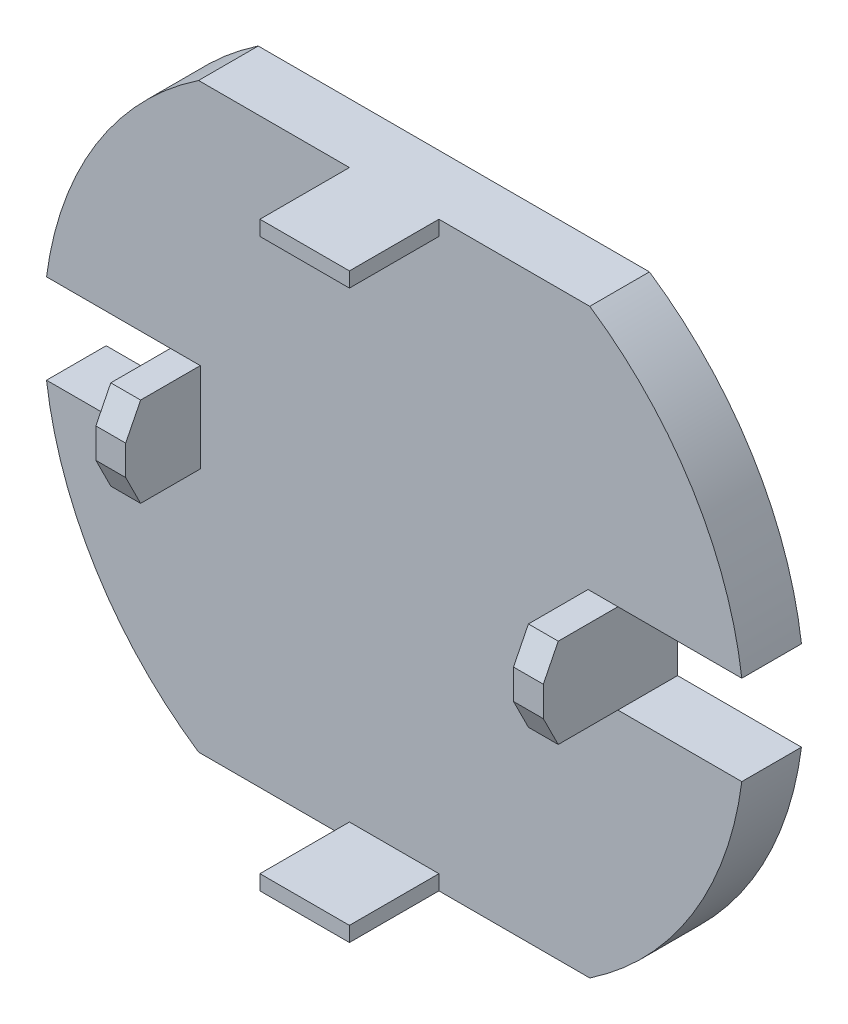
ISO-10303-21;
HEADER;
FILE_DESCRIPTION(('STEP AP214'),'2;1');
FILE_NAME('part.step','',(''),(''),'','','');
FILE_SCHEMA(('AUTOMOTIVE_DESIGN { 1 0 10303 214 1 1 1 1 }'));
ENDSEC;
DATA;
#1=APPLICATION_CONTEXT('core data for automotive mechanical design processes');
#2=APPLICATION_PROTOCOL_DEFINITION('international standard','automotive_design',2000,#1);
#3=PRODUCT_CONTEXT('',#1,'mechanical');
#4=PRODUCT('Part','Part','',(#3));
#5=PRODUCT_RELATED_PRODUCT_CATEGORY('part','',(#4));
#6=PRODUCT_DEFINITION_FORMATION('','',#4);
#7=PRODUCT_DEFINITION_CONTEXT('part definition',#1,'design');
#8=PRODUCT_DEFINITION('design','',#6,#7);
#9=PRODUCT_DEFINITION_SHAPE('','',#8);
#10=(LENGTH_UNIT() NAMED_UNIT(*) SI_UNIT(.MILLI.,.METRE.));
#11=(NAMED_UNIT(*) PLANE_ANGLE_UNIT() SI_UNIT($,.RADIAN.));
#12=(NAMED_UNIT(*) SI_UNIT($,.STERADIAN.) SOLID_ANGLE_UNIT());
#13=UNCERTAINTY_MEASURE_WITH_UNIT(LENGTH_MEASURE(1.E-05),#10,'distance_accuracy_value','');
#14=(GEOMETRIC_REPRESENTATION_CONTEXT(3) GLOBAL_UNCERTAINTY_ASSIGNED_CONTEXT((#13)) GLOBAL_UNIT_ASSIGNED_CONTEXT((#10,
#11,#12)) REPRESENTATION_CONTEXT('',''));
#15=CARTESIAN_POINT('',(0.,0.,0.));
#16=DIRECTION('',(0.,0.,1.));
#17=DIRECTION('',(1.,0.,0.));
#18=AXIS2_PLACEMENT_3D('',#15,#16,#17);
#19=CARTESIAN_POINT('',(0.,0.,0.));
#20=DIRECTION('',(0.,0.,-1.));
#21=DIRECTION('',(0.,-1.,0.));
#22=AXIS2_PLACEMENT_3D('',#19,#20,#21);
#23=PLANE('',#22);
#24=DIRECTION('',(1.,0.,0.));
#25=VECTOR('',#24,1.);
#26=CARTESIAN_POINT('',(-5.82693101040333,-0.75,0.));
#27=LINE('',#26,#25);
#28=CARTESIAN_POINT('',(-5.82693101040333,-0.75,0.));
#29=VERTEX_POINT('',#28);
#30=CARTESIAN_POINT('',(-3.75,-0.75,0.));
#31=VERTEX_POINT('',#30);
#32=EDGE_CURVE('E343',#29,#31,#27,.T.);
#33=ORIENTED_EDGE('',*,*,#32,.F.);
#34=CARTESIAN_POINT('',(0.,0.,0.));
#35=DIRECTION('',(0.,0.,-1.));
#36=DIRECTION('',(-0.558079874408681,-0.829787234042553,0.));
#37=AXIS2_PLACEMENT_3D('',#34,#35,#36);
#38=CIRCLE('',#37,5.875);
#39=CARTESIAN_POINT('',(-3.278719262151,-4.875,0.));
#40=VERTEX_POINT('',#39);
#41=EDGE_CURVE('E330',#40,#29,#38,.T.);
#42=ORIENTED_EDGE('',*,*,#41,.F.);
#43=DIRECTION('',(-1.,0.,0.));
#44=VECTOR('',#43,1.);
#45=CARTESIAN_POINT('',(-0.75,-4.875,0.));
#46=LINE('',#45,#44);
#47=CARTESIAN_POINT('',(-0.75,-4.875,0.));
#48=VERTEX_POINT('',#47);
#49=EDGE_CURVE('E417',#48,#40,#46,.T.);
#50=ORIENTED_EDGE('',*,*,#49,.F.);
#51=DIRECTION('',(0.,-1.,0.));
#52=VECTOR('',#51,1.);
#53=CARTESIAN_POINT('',(-0.75,-4.625,0.));
#54=LINE('',#53,#52);
#55=CARTESIAN_POINT('',(-0.75,-4.625,0.));
#56=VERTEX_POINT('',#55);
#57=EDGE_CURVE('E435',#56,#48,#54,.T.);
#58=ORIENTED_EDGE('',*,*,#57,.F.);
#59=DIRECTION('',(-1.,0.,0.));
#60=VECTOR('',#59,1.);
#61=CARTESIAN_POINT('',(0.75,-4.625,0.));
#62=LINE('',#61,#60);
#63=CARTESIAN_POINT('',(0.75,-4.625,0.));
#64=VERTEX_POINT('',#63);
#65=EDGE_CURVE('E369',#64,#56,#62,.T.);
#66=ORIENTED_EDGE('',*,*,#65,.F.);
#67=DIRECTION('',(0.,1.,0.));
#68=VECTOR('',#67,1.);
#69=CARTESIAN_POINT('',(0.75,-4.875,0.));
#70=LINE('',#69,#68);
#71=CARTESIAN_POINT('',(0.75,-4.875,0.));
#72=VERTEX_POINT('',#71);
#73=EDGE_CURVE('E386',#72,#64,#70,.T.);
#74=ORIENTED_EDGE('',*,*,#73,.F.);
#75=DIRECTION('',(-1.,0.,0.));
#76=VECTOR('',#75,1.);
#77=CARTESIAN_POINT('',(3.278719262151,-4.875,0.));
#78=LINE('',#77,#76);
#79=CARTESIAN_POINT('',(3.278719262151,-4.875,0.));
#80=VERTEX_POINT('',#79);
#81=EDGE_CURVE('E466',#80,#72,#78,.T.);
#82=ORIENTED_EDGE('',*,*,#81,.F.);
#83=CARTESIAN_POINT('',(0.,0.,0.));
#84=DIRECTION('',(0.,0.,-1.));
#85=DIRECTION('',(0.991818044323972,-0.127659574468085,0.));
#86=AXIS2_PLACEMENT_3D('',#83,#84,#85);
#87=CIRCLE('',#86,5.875);
#88=CARTESIAN_POINT('',(5.82693101040333,-0.75,0.));
#89=VERTEX_POINT('',#88);
#90=EDGE_CURVE('E363',#89,#80,#87,.T.);
#91=ORIENTED_EDGE('',*,*,#90,.F.);
#92=DIRECTION('',(1.,0.,0.));
#93=VECTOR('',#92,1.);
#94=CARTESIAN_POINT('',(3.25,-0.75,0.));
#95=LINE('',#94,#93);
#96=CARTESIAN_POINT('',(3.75,-0.75,0.));
#97=VERTEX_POINT('',#96);
#98=EDGE_CURVE('E111',#97,#89,#95,.T.);
#99=ORIENTED_EDGE('',*,*,#98,.F.);
#100=DIRECTION('',(1.,0.,0.));
#101=VECTOR('',#100,1.);
#102=CARTESIAN_POINT('',(3.25,-0.75,0.));
#103=LINE('',#102,#101);
#104=CARTESIAN_POINT('',(3.25,-0.75,0.));
#105=VERTEX_POINT('',#104);
#106=EDGE_CURVE('E405',#105,#97,#103,.T.);
#107=ORIENTED_EDGE('',*,*,#106,.F.);
#108=DIRECTION('',(0.,-1.,0.));
#109=VECTOR('',#108,1.);
#110=CARTESIAN_POINT('',(3.25,0.75,0.));
#111=LINE('',#110,#109);
#112=CARTESIAN_POINT('',(3.25,0.75,0.));
#113=VERTEX_POINT('',#112);
#114=EDGE_CURVE('E127',#113,#105,#111,.T.);
#115=ORIENTED_EDGE('',*,*,#114,.F.);
#116=DIRECTION('',(-1.,0.,0.));
#117=VECTOR('',#116,1.);
#118=CARTESIAN_POINT('',(5.82693101040333,0.75,0.));
#119=LINE('',#118,#117);
#120=CARTESIAN_POINT('',(3.75,0.75,0.));
#121=VERTEX_POINT('',#120);
#122=EDGE_CURVE('E350',#121,#113,#119,.T.);
#123=ORIENTED_EDGE('',*,*,#122,.F.);
#124=DIRECTION('',(-1.,0.,0.));
#125=VECTOR('',#124,1.);
#126=CARTESIAN_POINT('',(5.82693101040333,0.75,0.));
#127=LINE('',#126,#125);
#128=CARTESIAN_POINT('',(5.82693101040333,0.75,0.));
#129=VERTEX_POINT('',#128);
#130=EDGE_CURVE('E474',#129,#121,#127,.T.);
#131=ORIENTED_EDGE('',*,*,#130,.F.);
#132=CARTESIAN_POINT('',(0.,0.,0.));
#133=DIRECTION('',(0.,0.,-1.));
#134=DIRECTION('',(0.558079874408681,0.829787234042553,0.));
#135=AXIS2_PLACEMENT_3D('',#132,#133,#134);
#136=CIRCLE('',#135,5.875);
#137=CARTESIAN_POINT('',(3.278719262151,4.875,0.));
#138=VERTEX_POINT('',#137);
#139=EDGE_CURVE('E470',#138,#129,#136,.T.);
#140=ORIENTED_EDGE('',*,*,#139,.F.);
#141=DIRECTION('',(1.,0.,0.));
#142=VECTOR('',#141,1.);
#143=CARTESIAN_POINT('',(0.75,4.875,0.));
#144=LINE('',#143,#142);
#145=CARTESIAN_POINT('',(0.75,4.875,0.));
#146=VERTEX_POINT('',#145);
#147=EDGE_CURVE('E533',#146,#138,#144,.T.);
#148=ORIENTED_EDGE('',*,*,#147,.F.);
#149=DIRECTION('',(0.,1.,0.));
#150=VECTOR('',#149,1.);
#151=CARTESIAN_POINT('',(0.75,4.625,0.));
#152=LINE('',#151,#150);
#153=CARTESIAN_POINT('',(0.75,4.625,0.));
#154=VERTEX_POINT('',#153);
#155=EDGE_CURVE('E537',#154,#146,#152,.T.);
#156=ORIENTED_EDGE('',*,*,#155,.F.);
#157=DIRECTION('',(1.,0.,0.));
#158=VECTOR('',#157,1.);
#159=CARTESIAN_POINT('',(-0.75,4.625,0.));
#160=LINE('',#159,#158);
#161=CARTESIAN_POINT('',(-0.75,4.625,0.));
#162=VERTEX_POINT('',#161);
#163=EDGE_CURVE('E588',#162,#154,#160,.T.);
#164=ORIENTED_EDGE('',*,*,#163,.F.);
#165=DIRECTION('',(0.,-1.,0.));
#166=VECTOR('',#165,1.);
#167=CARTESIAN_POINT('',(-0.75,4.875,0.));
#168=LINE('',#167,#166);
#169=CARTESIAN_POINT('',(-0.75,4.875,0.));
#170=VERTEX_POINT('',#169);
#171=EDGE_CURVE('E423',#170,#162,#168,.T.);
#172=ORIENTED_EDGE('',*,*,#171,.F.);
#173=DIRECTION('',(1.,0.,0.));
#174=VECTOR('',#173,1.);
#175=CARTESIAN_POINT('',(-3.278719262151,4.875,0.));
#176=LINE('',#175,#174);
#177=CARTESIAN_POINT('',(-3.278719262151,4.875,0.));
#178=VERTEX_POINT('',#177);
#179=EDGE_CURVE('E20',#178,#170,#176,.T.);
#180=ORIENTED_EDGE('',*,*,#179,.F.);
#181=CARTESIAN_POINT('',(0.,0.,0.));
#182=DIRECTION('',(0.,0.,-1.));
#183=DIRECTION('',(-0.991818044323972,0.127659574468085,0.));
#184=AXIS2_PLACEMENT_3D('',#181,#182,#183);
#185=CIRCLE('',#184,5.875);
#186=CARTESIAN_POINT('',(-5.82693101040333,0.75,0.));
#187=VERTEX_POINT('',#186);
#188=EDGE_CURVE('E544',#187,#178,#185,.T.);
#189=ORIENTED_EDGE('',*,*,#188,.F.);
#190=DIRECTION('',(-1.,0.,0.));
#191=VECTOR('',#190,1.);
#192=CARTESIAN_POINT('',(-3.25,0.75,0.));
#193=LINE('',#192,#191);
#194=CARTESIAN_POINT('',(-3.75,0.75,0.));
#195=VERTEX_POINT('',#194);
#196=EDGE_CURVE('E27',#195,#187,#193,.T.);
#197=ORIENTED_EDGE('',*,*,#196,.F.);
#198=DIRECTION('',(-1.,0.,0.));
#199=VECTOR('',#198,1.);
#200=CARTESIAN_POINT('',(-3.25,0.75,0.));
#201=LINE('',#200,#199);
#202=CARTESIAN_POINT('',(-3.25,0.75,0.));
#203=VERTEX_POINT('',#202);
#204=EDGE_CURVE('E396',#203,#195,#201,.T.);
#205=ORIENTED_EDGE('',*,*,#204,.F.);
#206=DIRECTION('',(0.,1.,0.));
#207=VECTOR('',#206,1.);
#208=CARTESIAN_POINT('',(-3.25,-0.75,0.));
#209=LINE('',#208,#207);
#210=CARTESIAN_POINT('',(-3.25,-0.75,0.));
#211=VERTEX_POINT('',#210);
#212=EDGE_CURVE('E429',#211,#203,#209,.T.);
#213=ORIENTED_EDGE('',*,*,#212,.F.);
#214=DIRECTION('',(1.,0.,0.));
#215=VECTOR('',#214,1.);
#216=CARTESIAN_POINT('',(-5.82693101040333,-0.75,0.));
#217=LINE('',#216,#215);
#218=EDGE_CURVE('E345',#31,#211,#217,.T.);
#219=ORIENTED_EDGE('',*,*,#218,.F.);
#220=EDGE_LOOP('',(#33,#42,#50,#58,#66,#74,#82,#91,#99,#107,#115,#123,#131,#140,#148,#156,#164,
#172,#180,#189,#197,#205,#213,#219));
#221=FACE_BOUND('',#220,.T.);
#222=ADVANCED_FACE('F16',(#221),#23,.F.);
#223=CARTESIAN_POINT('',(0.,0.,-1.));
#224=DIRECTION('',(0.,0.,-1.));
#225=DIRECTION('',(0.,-1.,0.));
#226=AXIS2_PLACEMENT_3D('',#223,#224,#225);
#227=PLANE('',#226);
#228=CARTESIAN_POINT('',(0.,0.,-1.));
#229=DIRECTION('',(0.,0.,1.));
#230=DIRECTION('',(-1.,0.,0.));
#231=AXIS2_PLACEMENT_3D('',#228,#229,#230);
#232=CIRCLE('',#231,2.5);
#233=CARTESIAN_POINT('',(-2.5,0.,-1.));
#234=VERTEX_POINT('',#233);
#235=CARTESIAN_POINT('',(2.5,0.,-1.));
#236=VERTEX_POINT('',#235);
#237=EDGE_CURVE('E513',#234,#236,#232,.T.);
#238=ORIENTED_EDGE('',*,*,#237,.T.);
#239=CARTESIAN_POINT('',(0.,0.,-1.));
#240=DIRECTION('',(0.,0.,1.));
#241=DIRECTION('',(-1.,0.,0.));
#242=AXIS2_PLACEMENT_3D('',#239,#240,#241);
#243=CIRCLE('',#242,2.5);
#244=EDGE_CURVE('E509',#236,#234,#243,.T.);
#245=ORIENTED_EDGE('',*,*,#244,.T.);
#246=EDGE_LOOP('',(#238,#245));
#247=FACE_BOUND('',#246,.T.);
#248=DIRECTION('',(1.,0.,0.));
#249=VECTOR('',#248,1.);
#250=CARTESIAN_POINT('',(-5.82693101040333,-0.75,-1.));
#251=LINE('',#250,#249);
#252=CARTESIAN_POINT('',(-5.82693101040333,-0.75,-1.));
#253=VERTEX_POINT('',#252);
#254=CARTESIAN_POINT('',(-3.75,-0.75,-1.));
#255=VERTEX_POINT('',#254);
#256=EDGE_CURVE('E187',#253,#255,#251,.T.);
#257=ORIENTED_EDGE('',*,*,#256,.T.);
#258=DIRECTION('',(0.,-1.,0.));
#259=VECTOR('',#258,1.);
#260=CARTESIAN_POINT('',(-3.75,0.75,-1.));
#261=LINE('',#260,#259);
#262=CARTESIAN_POINT('',(-3.75,0.75,-1.));
#263=VERTEX_POINT('',#262);
#264=EDGE_CURVE('E359',#263,#255,#261,.T.);
#265=ORIENTED_EDGE('',*,*,#264,.F.);
#266=DIRECTION('',(-1.,0.,0.));
#267=VECTOR('',#266,1.);
#268=CARTESIAN_POINT('',(-3.25,0.75,-1.));
#269=LINE('',#268,#267);
#270=CARTESIAN_POINT('',(-5.82693101040333,0.75,-1.));
#271=VERTEX_POINT('',#270);
#272=EDGE_CURVE('E11',#263,#271,#269,.T.);
#273=ORIENTED_EDGE('',*,*,#272,.T.);
#274=CARTESIAN_POINT('',(0.,0.,-1.));
#275=DIRECTION('',(0.,0.,-1.));
#276=DIRECTION('',(-0.991818044323972,0.127659574468085,0.));
#277=AXIS2_PLACEMENT_3D('',#274,#275,#276);
#278=CIRCLE('',#277,5.875);
#279=CARTESIAN_POINT('',(-3.278719262151,4.875,-1.));
#280=VERTEX_POINT('',#279);
#281=EDGE_CURVE('E540',#271,#280,#278,.T.);
#282=ORIENTED_EDGE('',*,*,#281,.T.);
#283=DIRECTION('',(1.,0.,0.));
#284=VECTOR('',#283,1.);
#285=CARTESIAN_POINT('',(-3.278719262151,4.875,-1.));
#286=LINE('',#285,#284);
#287=CARTESIAN_POINT('',(3.278719262151,4.875,-1.));
#288=VERTEX_POINT('',#287);
#289=EDGE_CURVE('E529',#280,#288,#286,.T.);
#290=ORIENTED_EDGE('',*,*,#289,.T.);
#291=CARTESIAN_POINT('',(0.,0.,-1.));
#292=DIRECTION('',(0.,0.,-1.));
#293=DIRECTION('',(0.558079874408681,0.829787234042553,0.));
#294=AXIS2_PLACEMENT_3D('',#291,#292,#293);
#295=CIRCLE('',#294,5.875);
#296=CARTESIAN_POINT('',(5.82693101040333,0.75,-1.));
#297=VERTEX_POINT('',#296);
#298=EDGE_CURVE('E473',#288,#297,#295,.T.);
#299=ORIENTED_EDGE('',*,*,#298,.T.);
#300=DIRECTION('',(-1.,0.,0.));
#301=VECTOR('',#300,1.);
#302=CARTESIAN_POINT('',(5.82693101040333,0.75,-1.));
#303=LINE('',#302,#301);
#304=CARTESIAN_POINT('',(3.75,0.75,-1.));
#305=VERTEX_POINT('',#304);
#306=EDGE_CURVE('E591',#297,#305,#303,.T.);
#307=ORIENTED_EDGE('',*,*,#306,.T.);
#308=DIRECTION('',(0.,1.,0.));
#309=VECTOR('',#308,1.);
#310=CARTESIAN_POINT('',(3.75,-0.75,-1.));
#311=LINE('',#310,#309);
#312=CARTESIAN_POINT('',(3.75,-0.75,-1.));
#313=VERTEX_POINT('',#312);
#314=EDGE_CURVE('E456',#313,#305,#311,.T.);
#315=ORIENTED_EDGE('',*,*,#314,.F.);
#316=DIRECTION('',(1.,0.,0.));
#317=VECTOR('',#316,1.);
#318=CARTESIAN_POINT('',(3.25,-0.75,-1.));
#319=LINE('',#318,#317);
#320=CARTESIAN_POINT('',(5.82693101040333,-0.75,-1.));
#321=VERTEX_POINT('',#320);
#322=EDGE_CURVE('E583',#313,#321,#319,.T.);
#323=ORIENTED_EDGE('',*,*,#322,.T.);
#324=CARTESIAN_POINT('',(0.,0.,-1.));
#325=DIRECTION('',(0.,0.,-1.));
#326=DIRECTION('',(0.991818044323972,-0.127659574468085,0.));
#327=AXIS2_PLACEMENT_3D('',#324,#325,#326);
#328=CIRCLE('',#327,5.875);
#329=CARTESIAN_POINT('',(3.278719262151,-4.875,-1.));
#330=VERTEX_POINT('',#329);
#331=EDGE_CURVE('E487',#321,#330,#328,.T.);
#332=ORIENTED_EDGE('',*,*,#331,.T.);
#333=DIRECTION('',(-1.,0.,0.));
#334=VECTOR('',#333,1.);
#335=CARTESIAN_POINT('',(3.278719262151,-4.875,-1.));
#336=LINE('',#335,#334);
#337=CARTESIAN_POINT('',(-3.278719262151,-4.875,-1.));
#338=VERTEX_POINT('',#337);
#339=EDGE_CURVE('E413',#330,#338,#336,.T.);
#340=ORIENTED_EDGE('',*,*,#339,.T.);
#341=CARTESIAN_POINT('',(0.,0.,-1.));
#342=DIRECTION('',(0.,0.,-1.));
#343=DIRECTION('',(-0.558079874408681,-0.829787234042553,0.));
#344=AXIS2_PLACEMENT_3D('',#341,#342,#343);
#345=CIRCLE('',#344,5.875);
#346=EDGE_CURVE('E339',#338,#253,#345,.T.);
#347=ORIENTED_EDGE('',*,*,#346,.T.);
#348=EDGE_LOOP('',(#257,#265,#273,#282,#290,#299,#307,#315,#323,#332,#340,#347));
#349=FACE_BOUND('',#348,.T.);
#350=ADVANCED_FACE('F805',(#247,#349),#227,.T.);
#351=CARTESIAN_POINT('',(-3.25,0.75,0.));
#352=DIRECTION('',(0.,-1.,0.));
#353=DIRECTION('',(0.,0.,-1.));
#354=AXIS2_PLACEMENT_3D('',#351,#352,#353);
#355=PLANE('',#354);
#356=DIRECTION('',(0.,0.,1.));
#357=VECTOR('',#356,1.);
#358=CARTESIAN_POINT('',(-3.75,0.75,0.0625));
#359=LINE('',#358,#357);
#360=EDGE_CURVE('E457',#263,#195,#359,.T.);
#361=ORIENTED_EDGE('',*,*,#360,.T.);
#362=ORIENTED_EDGE('',*,*,#196,.T.);
#363=DIRECTION('',(0.,0.,-1.));
#364=VECTOR('',#363,1.);
#365=CARTESIAN_POINT('',(-5.82693101040333,0.75,0.));
#366=LINE('',#365,#364);
#367=EDGE_CURVE('E543',#187,#271,#366,.T.);
#368=ORIENTED_EDGE('',*,*,#367,.T.);
#369=ORIENTED_EDGE('',*,*,#272,.F.);
#370=EDGE_LOOP('',(#361,#362,#368,#369));
#371=FACE_BOUND('',#370,.T.);
#372=ADVANCED_FACE('F801',(#371),#355,.T.);
#373=CARTESIAN_POINT('',(0.,0.,0.));
#374=DIRECTION('',(0.,0.,-1.));
#375=DIRECTION('',(-0.991818044323972,0.127659574468085,0.));
#376=AXIS2_PLACEMENT_3D('',#373,#374,#375);
#377=CYLINDRICAL_SURFACE('',#376,5.875);
#378=ORIENTED_EDGE('',*,*,#188,.T.);
#379=DIRECTION('',(0.,0.,-1.));
#380=VECTOR('',#379,1.);
#381=CARTESIAN_POINT('',(-3.278719262151,4.875,0.));
#382=LINE('',#381,#380);
#383=EDGE_CURVE('E532',#178,#280,#382,.T.);
#384=ORIENTED_EDGE('',*,*,#383,.T.);
#385=ORIENTED_EDGE('',*,*,#281,.F.);
#386=ORIENTED_EDGE('',*,*,#367,.F.);
#387=EDGE_LOOP('',(#378,#384,#385,#386));
#388=FACE_BOUND('',#387,.T.);
#389=ADVANCED_FACE('F682',(#388),#377,.T.);
#390=CARTESIAN_POINT('',(-3.278719262151,4.875,0.));
#391=DIRECTION('',(0.,1.,0.));
#392=DIRECTION('',(1.,0.,0.));
#393=AXIS2_PLACEMENT_3D('',#390,#391,#392);
#394=PLANE('',#393);
#395=ORIENTED_EDGE('',*,*,#179,.T.);
#396=DIRECTION('',(0.,0.,1.));
#397=VECTOR('',#396,1.);
#398=CARTESIAN_POINT('',(-0.75,4.875,-1.));
#399=LINE('',#398,#397);
#400=CARTESIAN_POINT('',(-0.75,4.875,1.5));
#401=VERTEX_POINT('',#400);
#402=EDGE_CURVE('E554',#170,#401,#399,.T.);
#403=ORIENTED_EDGE('',*,*,#402,.T.);
#404=DIRECTION('',(1.,0.,0.));
#405=VECTOR('',#404,1.);
#406=CARTESIAN_POINT('',(0.375,4.875,1.5));
#407=LINE('',#406,#405);
#408=CARTESIAN_POINT('',(0.75,4.875,1.5));
#409=VERTEX_POINT('',#408);
#410=EDGE_CURVE('E219',#401,#409,#407,.T.);
#411=ORIENTED_EDGE('',*,*,#410,.T.);
#412=DIRECTION('',(0.,0.,1.));
#413=VECTOR('',#412,1.);
#414=CARTESIAN_POINT('',(0.75,4.875,-1.));
#415=LINE('',#414,#413);
#416=EDGE_CURVE('E520',#146,#409,#415,.T.);
#417=ORIENTED_EDGE('',*,*,#416,.F.);
#418=ORIENTED_EDGE('',*,*,#147,.T.);
#419=DIRECTION('',(0.,0.,-1.));
#420=VECTOR('',#419,1.);
#421=CARTESIAN_POINT('',(3.278719262151,4.875,0.));
#422=LINE('',#421,#420);
#423=EDGE_CURVE('E653',#138,#288,#422,.T.);
#424=ORIENTED_EDGE('',*,*,#423,.T.);
#425=ORIENTED_EDGE('',*,*,#289,.F.);
#426=ORIENTED_EDGE('',*,*,#383,.F.);
#427=EDGE_LOOP('',(#395,#403,#411,#417,#418,#424,#425,#426));
#428=FACE_BOUND('',#427,.T.);
#429=ADVANCED_FACE('F689',(#428),#394,.T.);
#430=CARTESIAN_POINT('',(0.,0.,0.));
#431=DIRECTION('',(0.,0.,-1.));
#432=DIRECTION('',(0.558079874408681,0.829787234042553,0.));
#433=AXIS2_PLACEMENT_3D('',#430,#431,#432);
#434=CYLINDRICAL_SURFACE('',#433,5.875);
#435=ORIENTED_EDGE('',*,*,#139,.T.);
#436=DIRECTION('',(0.,0.,-1.));
#437=VECTOR('',#436,1.);
#438=CARTESIAN_POINT('',(5.82693101040333,0.75,0.));
#439=LINE('',#438,#437);
#440=EDGE_CURVE('E645',#129,#297,#439,.T.);
#441=ORIENTED_EDGE('',*,*,#440,.T.);
#442=ORIENTED_EDGE('',*,*,#298,.F.);
#443=ORIENTED_EDGE('',*,*,#423,.F.);
#444=EDGE_LOOP('',(#435,#441,#442,#443));
#445=FACE_BOUND('',#444,.T.);
#446=ADVANCED_FACE('F745',(#445),#434,.T.);
#447=CARTESIAN_POINT('',(5.82693101040333,0.75,0.));
#448=DIRECTION('',(0.,-1.,0.));
#449=DIRECTION('',(0.,0.,-1.));
#450=AXIS2_PLACEMENT_3D('',#447,#448,#449);
#451=PLANE('',#450);
#452=DIRECTION('',(0.,0.,-1.));
#453=VECTOR('',#452,1.);
#454=CARTESIAN_POINT('',(3.75,0.75,0.0625));
#455=LINE('',#454,#453);
#456=EDGE_CURVE('E452',#121,#305,#455,.T.);
#457=ORIENTED_EDGE('',*,*,#456,.T.);
#458=ORIENTED_EDGE('',*,*,#306,.F.);
#459=ORIENTED_EDGE('',*,*,#440,.F.);
#460=ORIENTED_EDGE('',*,*,#130,.T.);
#461=EDGE_LOOP('',(#457,#458,#459,#460));
#462=FACE_BOUND('',#461,.T.);
#463=ADVANCED_FACE('F725',(#462),#451,.T.);
#464=CARTESIAN_POINT('',(3.25,-0.75,0.));
#465=DIRECTION('',(0.,1.,0.));
#466=DIRECTION('',(1.,0.,0.));
#467=AXIS2_PLACEMENT_3D('',#464,#465,#466);
#468=PLANE('',#467);
#469=DIRECTION('',(0.,0.,1.));
#470=VECTOR('',#469,1.);
#471=CARTESIAN_POINT('',(3.75,-0.75,0.0625));
#472=LINE('',#471,#470);
#473=EDGE_CURVE('E391',#313,#97,#472,.T.);
#474=ORIENTED_EDGE('',*,*,#473,.T.);
#475=ORIENTED_EDGE('',*,*,#98,.T.);
#476=DIRECTION('',(0.,0.,-1.));
#477=VECTOR('',#476,1.);
#478=CARTESIAN_POINT('',(5.82693101040333,-0.75,0.));
#479=LINE('',#478,#477);
#480=EDGE_CURVE('E483',#89,#321,#479,.T.);
#481=ORIENTED_EDGE('',*,*,#480,.T.);
#482=ORIENTED_EDGE('',*,*,#322,.F.);
#483=EDGE_LOOP('',(#474,#475,#481,#482));
#484=FACE_BOUND('',#483,.T.);
#485=ADVANCED_FACE('F720',(#484),#468,.T.);
#486=CARTESIAN_POINT('',(0.,0.,0.));
#487=DIRECTION('',(0.,0.,-1.));
#488=DIRECTION('',(0.991818044323972,-0.127659574468085,0.));
#489=AXIS2_PLACEMENT_3D('',#486,#487,#488);
#490=CYLINDRICAL_SURFACE('',#489,5.875);
#491=ORIENTED_EDGE('',*,*,#90,.T.);
#492=DIRECTION('',(0.,0.,-1.));
#493=VECTOR('',#492,1.);
#494=CARTESIAN_POINT('',(3.278719262151,-4.875,0.));
#495=LINE('',#494,#493);
#496=EDGE_CURVE('E416',#80,#330,#495,.T.);
#497=ORIENTED_EDGE('',*,*,#496,.T.);
#498=ORIENTED_EDGE('',*,*,#331,.F.);
#499=ORIENTED_EDGE('',*,*,#480,.F.);
#500=EDGE_LOOP('',(#491,#497,#498,#499));
#501=FACE_BOUND('',#500,.T.);
#502=ADVANCED_FACE('F724',(#501),#490,.T.);
#503=CARTESIAN_POINT('',(3.278719262151,-4.875,0.));
#504=DIRECTION('',(0.,-1.,0.));
#505=DIRECTION('',(0.,0.,-1.));
#506=AXIS2_PLACEMENT_3D('',#503,#504,#505);
#507=PLANE('',#506);
#508=ORIENTED_EDGE('',*,*,#81,.T.);
#509=DIRECTION('',(0.,0.,1.));
#510=VECTOR('',#509,1.);
#511=CARTESIAN_POINT('',(0.75,-4.875,-1.));
#512=LINE('',#511,#510);
#513=CARTESIAN_POINT('',(0.75,-4.875,1.5));
#514=VERTEX_POINT('',#513);
#515=EDGE_CURVE('E374',#72,#514,#512,.T.);
#516=ORIENTED_EDGE('',*,*,#515,.T.);
#517=DIRECTION('',(-1.,0.,0.));
#518=VECTOR('',#517,1.);
#519=CARTESIAN_POINT('',(-0.375,-4.875,1.5));
#520=LINE('',#519,#518);
#521=CARTESIAN_POINT('',(-0.75,-4.875,1.5));
#522=VERTEX_POINT('',#521);
#523=EDGE_CURVE('E340',#514,#522,#520,.T.);
#524=ORIENTED_EDGE('',*,*,#523,.T.);
#525=DIRECTION('',(0.,0.,1.));
#526=VECTOR('',#525,1.);
#527=CARTESIAN_POINT('',(-0.75,-4.875,-1.));
#528=LINE('',#527,#526);
#529=EDGE_CURVE('E439',#48,#522,#528,.T.);
#530=ORIENTED_EDGE('',*,*,#529,.F.);
#531=ORIENTED_EDGE('',*,*,#49,.T.);
#532=DIRECTION('',(0.,0.,-1.));
#533=VECTOR('',#532,1.);
#534=CARTESIAN_POINT('',(-3.278719262151,-4.875,0.));
#535=LINE('',#534,#533);
#536=EDGE_CURVE('E337',#40,#338,#535,.T.);
#537=ORIENTED_EDGE('',*,*,#536,.T.);
#538=ORIENTED_EDGE('',*,*,#339,.F.);
#539=ORIENTED_EDGE('',*,*,#496,.F.);
#540=EDGE_LOOP('',(#508,#516,#524,#530,#531,#537,#538,#539));
#541=FACE_BOUND('',#540,.T.);
#542=ADVANCED_FACE('F607',(#541),#507,.T.);
#543=CARTESIAN_POINT('',(0.,0.,0.));
#544=DIRECTION('',(0.,0.,-1.));
#545=DIRECTION('',(-0.558079874408681,-0.829787234042553,0.));
#546=AXIS2_PLACEMENT_3D('',#543,#544,#545);
#547=CYLINDRICAL_SURFACE('',#546,5.875);
#548=ORIENTED_EDGE('',*,*,#41,.T.);
#549=DIRECTION('',(0.,0.,-1.));
#550=VECTOR('',#549,1.);
#551=CARTESIAN_POINT('',(-5.82693101040333,-0.75,0.));
#552=LINE('',#551,#550);
#553=EDGE_CURVE('E335',#29,#253,#552,.T.);
#554=ORIENTED_EDGE('',*,*,#553,.T.);
#555=ORIENTED_EDGE('',*,*,#346,.F.);
#556=ORIENTED_EDGE('',*,*,#536,.F.);
#557=EDGE_LOOP('',(#548,#554,#555,#556));
#558=FACE_BOUND('',#557,.T.);
#559=ADVANCED_FACE('F332',(#558),#547,.T.);
#560=CARTESIAN_POINT('',(0.,0.,1.5));
#561=DIRECTION('',(0.,0.,1.));
#562=DIRECTION('',(1.,0.,0.));
#563=AXIS2_PLACEMENT_3D('',#560,#561,#562);
#564=PLANE('',#563);
#565=ORIENTED_EDGE('',*,*,#523,.F.);
#566=DIRECTION('',(0.,-1.,0.));
#567=VECTOR('',#566,1.);
#568=CARTESIAN_POINT('',(0.75,-2.4375,1.5));
#569=LINE('',#568,#567);
#570=CARTESIAN_POINT('',(0.75,-4.625,1.5));
#571=VERTEX_POINT('',#570);
#572=EDGE_CURVE('E523',#571,#514,#569,.T.);
#573=ORIENTED_EDGE('',*,*,#572,.F.);
#574=DIRECTION('',(1.,0.,0.));
#575=VECTOR('',#574,1.);
#576=CARTESIAN_POINT('',(0.375,-4.625,1.5));
#577=LINE('',#576,#575);
#578=CARTESIAN_POINT('',(-0.75,-4.625,1.5));
#579=VERTEX_POINT('',#578);
#580=EDGE_CURVE('E440',#579,#571,#577,.T.);
#581=ORIENTED_EDGE('',*,*,#580,.F.);
#582=DIRECTION('',(0.,1.,0.));
#583=VECTOR('',#582,1.);
#584=CARTESIAN_POINT('',(-0.75,-2.3125,1.5));
#585=LINE('',#584,#583);
#586=EDGE_CURVE('E465',#522,#579,#585,.T.);
#587=ORIENTED_EDGE('',*,*,#586,.F.);
#588=EDGE_LOOP('',(#565,#573,#581,#587));
#589=FACE_BOUND('',#588,.T.);
#590=ADVANCED_FACE('F619',(#589),#564,.T.);
#591=CARTESIAN_POINT('',(-0.75,-4.625,-1.));
#592=DIRECTION('',(-1.,0.,0.));
#593=DIRECTION('',(0.,0.,1.));
#594=AXIS2_PLACEMENT_3D('',#591,#592,#593);
#595=PLANE('',#594);
#596=ORIENTED_EDGE('',*,*,#57,.T.);
#597=ORIENTED_EDGE('',*,*,#529,.T.);
#598=ORIENTED_EDGE('',*,*,#586,.T.);
#599=DIRECTION('',(0.,0.,1.));
#600=VECTOR('',#599,1.);
#601=CARTESIAN_POINT('',(-0.75,-4.625,-1.));
#602=LINE('',#601,#600);
#603=EDGE_CURVE('E373',#56,#579,#602,.T.);
#604=ORIENTED_EDGE('',*,*,#603,.F.);
#605=EDGE_LOOP('',(#596,#597,#598,#604));
#606=FACE_BOUND('',#605,.T.);
#607=ADVANCED_FACE('F859',(#606),#595,.T.);
#608=CARTESIAN_POINT('',(0.75,-4.625,-1.));
#609=DIRECTION('',(0.,1.,0.));
#610=DIRECTION('',(1.,0.,0.));
#611=AXIS2_PLACEMENT_3D('',#608,#609,#610);
#612=PLANE('',#611);
#613=ORIENTED_EDGE('',*,*,#65,.T.);
#614=ORIENTED_EDGE('',*,*,#603,.T.);
#615=ORIENTED_EDGE('',*,*,#580,.T.);
#616=DIRECTION('',(0.,0.,1.));
#617=VECTOR('',#616,1.);
#618=CARTESIAN_POINT('',(0.75,-4.625,-1.));
#619=LINE('',#618,#617);
#620=EDGE_CURVE('E395',#64,#571,#619,.T.);
#621=ORIENTED_EDGE('',*,*,#620,.F.);
#622=EDGE_LOOP('',(#613,#614,#615,#621));
#623=FACE_BOUND('',#622,.T.);
#624=ADVANCED_FACE('F891',(#623),#612,.T.);
#625=CARTESIAN_POINT('',(0.75,-4.875,-1.));
#626=DIRECTION('',(1.,0.,0.));
#627=DIRECTION('',(0.,1.,0.));
#628=AXIS2_PLACEMENT_3D('',#625,#626,#627);
#629=PLANE('',#628);
#630=ORIENTED_EDGE('',*,*,#73,.T.);
#631=ORIENTED_EDGE('',*,*,#620,.T.);
#632=ORIENTED_EDGE('',*,*,#572,.T.);
#633=ORIENTED_EDGE('',*,*,#515,.F.);
#634=EDGE_LOOP('',(#630,#631,#632,#633));
#635=FACE_BOUND('',#634,.T.);
#636=ADVANCED_FACE('F615',(#635),#629,.T.);
#637=CARTESIAN_POINT('',(0.,0.,1.5));
#638=DIRECTION('',(0.,0.,1.));
#639=DIRECTION('',(1.,0.,0.));
#640=AXIS2_PLACEMENT_3D('',#637,#638,#639);
#641=PLANE('',#640);
#642=ORIENTED_EDGE('',*,*,#410,.F.);
#643=DIRECTION('',(0.,1.,0.));
#644=VECTOR('',#643,1.);
#645=CARTESIAN_POINT('',(-0.75,2.4375,1.5));
#646=LINE('',#645,#644);
#647=CARTESIAN_POINT('',(-0.75,4.625,1.5));
#648=VERTEX_POINT('',#647);
#649=EDGE_CURVE('E422',#648,#401,#646,.T.);
#650=ORIENTED_EDGE('',*,*,#649,.F.);
#651=DIRECTION('',(-1.,0.,0.));
#652=VECTOR('',#651,1.);
#653=CARTESIAN_POINT('',(-0.375,4.625,1.5));
#654=LINE('',#653,#652);
#655=CARTESIAN_POINT('',(0.75,4.625,1.5));
#656=VERTEX_POINT('',#655);
#657=EDGE_CURVE('E207',#656,#648,#654,.T.);
#658=ORIENTED_EDGE('',*,*,#657,.F.);
#659=DIRECTION('',(0.,-1.,0.));
#660=VECTOR('',#659,1.);
#661=CARTESIAN_POINT('',(0.75,2.3125,1.5));
#662=LINE('',#661,#660);
#663=EDGE_CURVE('E387',#409,#656,#662,.T.);
#664=ORIENTED_EDGE('',*,*,#663,.F.);
#665=EDGE_LOOP('',(#642,#650,#658,#664));
#666=FACE_BOUND('',#665,.T.);
#667=ADVANCED_FACE('F759',(#666),#641,.T.);
#668=CARTESIAN_POINT('',(0.75,4.625,-1.));
#669=DIRECTION('',(1.,0.,0.));
#670=DIRECTION('',(0.,1.,0.));
#671=AXIS2_PLACEMENT_3D('',#668,#669,#670);
#672=PLANE('',#671);
#673=ORIENTED_EDGE('',*,*,#155,.T.);
#674=ORIENTED_EDGE('',*,*,#416,.T.);
#675=ORIENTED_EDGE('',*,*,#663,.T.);
#676=DIRECTION('',(0.,0.,1.));
#677=VECTOR('',#676,1.);
#678=CARTESIAN_POINT('',(0.75,4.625,-1.));
#679=LINE('',#678,#677);
#680=EDGE_CURVE('E574',#154,#656,#679,.T.);
#681=ORIENTED_EDGE('',*,*,#680,.F.);
#682=EDGE_LOOP('',(#673,#674,#675,#681));
#683=FACE_BOUND('',#682,.T.);
#684=ADVANCED_FACE('F763',(#683),#672,.T.);
#685=CARTESIAN_POINT('',(-0.75,4.625,-1.));
#686=DIRECTION('',(0.,-1.,0.));
#687=DIRECTION('',(0.,0.,-1.));
#688=AXIS2_PLACEMENT_3D('',#685,#686,#687);
#689=PLANE('',#688);
#690=ORIENTED_EDGE('',*,*,#163,.T.);
#691=ORIENTED_EDGE('',*,*,#680,.T.);
#692=ORIENTED_EDGE('',*,*,#657,.T.);
#693=DIRECTION('',(0.,0.,1.));
#694=VECTOR('',#693,1.);
#695=CARTESIAN_POINT('',(-0.75,4.625,-1.));
#696=LINE('',#695,#694);
#697=EDGE_CURVE('E418',#162,#648,#696,.T.);
#698=ORIENTED_EDGE('',*,*,#697,.F.);
#699=EDGE_LOOP('',(#690,#691,#692,#698));
#700=FACE_BOUND('',#699,.T.);
#701=ADVANCED_FACE('F841',(#700),#689,.T.);
#702=CARTESIAN_POINT('',(-0.75,4.875,-1.));
#703=DIRECTION('',(-1.,0.,0.));
#704=DIRECTION('',(0.,0.,1.));
#705=AXIS2_PLACEMENT_3D('',#702,#703,#704);
#706=PLANE('',#705);
#707=ORIENTED_EDGE('',*,*,#171,.T.);
#708=ORIENTED_EDGE('',*,*,#697,.T.);
#709=ORIENTED_EDGE('',*,*,#649,.T.);
#710=ORIENTED_EDGE('',*,*,#402,.F.);
#711=EDGE_LOOP('',(#707,#708,#709,#710));
#712=FACE_BOUND('',#711,.T.);
#713=ADVANCED_FACE('F871',(#712),#706,.T.);
#714=CARTESIAN_POINT('',(0.,0.,-2.));
#715=DIRECTION('',(0.,0.,-1.));
#716=DIRECTION('',(0.,-1.,0.));
#717=AXIS2_PLACEMENT_3D('',#714,#715,#716);
#718=PLANE('',#717);
#719=CARTESIAN_POINT('',(0.,0.,-2.));
#720=DIRECTION('',(0.,0.,-1.));
#721=DIRECTION('',(-1.,0.,0.));
#722=AXIS2_PLACEMENT_3D('',#719,#720,#721);
#723=CIRCLE('',#722,2.5);
#724=CARTESIAN_POINT('',(-2.5,0.,-2.));
#725=VERTEX_POINT('',#724);
#726=CARTESIAN_POINT('',(2.5,0.,-2.));
#727=VERTEX_POINT('',#726);
#728=EDGE_CURVE('E390',#725,#727,#723,.T.);
#729=ORIENTED_EDGE('',*,*,#728,.T.);
#730=CARTESIAN_POINT('',(0.,0.,-2.));
#731=DIRECTION('',(0.,0.,-1.));
#732=DIRECTION('',(-1.,0.,0.));
#733=AXIS2_PLACEMENT_3D('',#730,#731,#732);
#734=CIRCLE('',#733,2.5);
#735=EDGE_CURVE('E478',#727,#725,#734,.T.);
#736=ORIENTED_EDGE('',*,*,#735,.T.);
#737=EDGE_LOOP('',(#729,#736));
#738=FACE_BOUND('',#737,.T.);
#739=ADVANCED_FACE('F875',(#738),#718,.T.);
#740=CARTESIAN_POINT('',(0.,0.,-1.));
#741=DIRECTION('',(0.,0.,-1.));
#742=DIRECTION('',(-1.,0.,0.));
#743=AXIS2_PLACEMENT_3D('',#740,#741,#742);
#744=CYLINDRICAL_SURFACE('',#743,2.5);
#745=ORIENTED_EDGE('',*,*,#728,.F.);
#746=ORIENTED_EDGE('',*,*,#735,.F.);
#747=DIRECTION('',(0.,0.,1.));
#748=VECTOR('',#747,1.);
#749=CARTESIAN_POINT('',(2.5,0.,-1.));
#750=LINE('',#749,#748);
#751=EDGE_CURVE('E598',#727,#236,#750,.T.);
#752=ORIENTED_EDGE('',*,*,#751,.T.);
#753=ORIENTED_EDGE('',*,*,#237,.F.);
#754=ORIENTED_EDGE('',*,*,#244,.F.);
#755=ORIENTED_EDGE('',*,*,#751,.F.);
#756=EDGE_LOOP('',(#745,#746,#752,#753,#754,#755));
#757=FACE_BOUND('',#756,.T.);
#758=ADVANCED_FACE('F781',(#757),#744,.T.);
#759=CARTESIAN_POINT('',(3.25,0.,0.125));
#760=DIRECTION('',(1.,0.,0.));
#761=DIRECTION('',(0.,1.,0.));
#762=AXIS2_PLACEMENT_3D('',#759,#760,#761);
#763=PLANE('',#762);
#764=ORIENTED_EDGE('',*,*,#114,.T.);
#765=DIRECTION('',(0.,0.,-1.));
#766=VECTOR('',#765,1.);
#767=CARTESIAN_POINT('',(3.25,-0.75,1.));
#768=LINE('',#767,#766);
#769=CARTESIAN_POINT('',(3.25,-0.75,1.));
#770=VERTEX_POINT('',#769);
#771=EDGE_CURVE('E368',#770,#105,#768,.T.);
#772=ORIENTED_EDGE('',*,*,#771,.F.);
#773=DIRECTION('',(0.,-0.894427190999916,-0.447213595499958));
#774=VECTOR('',#773,1.);
#775=CARTESIAN_POINT('',(3.25,-0.25,1.25));
#776=LINE('',#775,#774);
#777=CARTESIAN_POINT('',(3.25,-0.25,1.25));
#778=VERTEX_POINT('',#777);
#779=EDGE_CURVE('E365',#778,#770,#776,.T.);
#780=ORIENTED_EDGE('',*,*,#779,.F.);
#781=DIRECTION('',(0.,-1.,0.));
#782=VECTOR('',#781,1.);
#783=CARTESIAN_POINT('',(3.25,0.25,1.25));
#784=LINE('',#783,#782);
#785=CARTESIAN_POINT('',(3.25,0.25,1.25));
#786=VERTEX_POINT('',#785);
#787=EDGE_CURVE('E272',#786,#778,#784,.T.);
#788=ORIENTED_EDGE('',*,*,#787,.F.);
#789=DIRECTION('',(0.,-0.894427190999916,0.447213595499958));
#790=VECTOR('',#789,1.);
#791=CARTESIAN_POINT('',(3.25,0.75,1.));
#792=LINE('',#791,#790);
#793=CARTESIAN_POINT('',(3.25,0.75,1.));
#794=VERTEX_POINT('',#793);
#795=EDGE_CURVE('E234',#794,#786,#792,.T.);
#796=ORIENTED_EDGE('',*,*,#795,.F.);
#797=DIRECTION('',(0.,0.,1.));
#798=VECTOR('',#797,1.);
#799=CARTESIAN_POINT('',(3.25,0.75,-1.));
#800=LINE('',#799,#798);
#801=EDGE_CURVE('E490',#113,#794,#800,.T.);
#802=ORIENTED_EDGE('',*,*,#801,.F.);
#803=EDGE_LOOP('',(#764,#772,#780,#788,#796,#802));
#804=FACE_BOUND('',#803,.T.);
#805=ADVANCED_FACE('F776',(#804),#763,.F.);
#806=CARTESIAN_POINT('',(3.75,0.,0.125));
#807=DIRECTION('',(1.,0.,0.));
#808=DIRECTION('',(0.,1.,0.));
#809=AXIS2_PLACEMENT_3D('',#806,#807,#808);
#810=PLANE('',#809);
#811=ORIENTED_EDGE('',*,*,#314,.T.);
#812=ORIENTED_EDGE('',*,*,#456,.F.);
#813=DIRECTION('',(0.,0.,1.));
#814=VECTOR('',#813,1.);
#815=CARTESIAN_POINT('',(3.75,0.75,-1.));
#816=LINE('',#815,#814);
#817=CARTESIAN_POINT('',(3.75,0.75,1.));
#818=VERTEX_POINT('',#817);
#819=EDGE_CURVE('E409',#121,#818,#816,.T.);
#820=ORIENTED_EDGE('',*,*,#819,.T.);
#821=DIRECTION('',(0.,-0.894427190999916,0.447213595499958));
#822=VECTOR('',#821,1.);
#823=CARTESIAN_POINT('',(3.75,0.75,1.));
#824=LINE('',#823,#822);
#825=CARTESIAN_POINT('',(3.75,0.25,1.25));
#826=VERTEX_POINT('',#825);
#827=EDGE_CURVE('E482',#818,#826,#824,.T.);
#828=ORIENTED_EDGE('',*,*,#827,.T.);
#829=DIRECTION('',(0.,-1.,0.));
#830=VECTOR('',#829,1.);
#831=CARTESIAN_POINT('',(3.75,0.25,1.25));
#832=LINE('',#831,#830);
#833=CARTESIAN_POINT('',(3.75,-0.25,1.25));
#834=VERTEX_POINT('',#833);
#835=EDGE_CURVE('E283',#826,#834,#832,.T.);
#836=ORIENTED_EDGE('',*,*,#835,.T.);
#837=DIRECTION('',(0.,-0.894427190999916,-0.447213595499958));
#838=VECTOR('',#837,1.);
#839=CARTESIAN_POINT('',(3.75,-0.25,1.25));
#840=LINE('',#839,#838);
#841=CARTESIAN_POINT('',(3.75,-0.75,1.));
#842=VERTEX_POINT('',#841);
#843=EDGE_CURVE('E367',#834,#842,#840,.T.);
#844=ORIENTED_EDGE('',*,*,#843,.T.);
#845=DIRECTION('',(0.,0.,-1.));
#846=VECTOR('',#845,1.);
#847=CARTESIAN_POINT('',(3.75,-0.75,1.));
#848=LINE('',#847,#846);
#849=EDGE_CURVE('E383',#842,#97,#848,.T.);
#850=ORIENTED_EDGE('',*,*,#849,.T.);
#851=ORIENTED_EDGE('',*,*,#473,.F.);
#852=EDGE_LOOP('',(#811,#812,#820,#828,#836,#844,#850,#851));
#853=FACE_BOUND('',#852,.T.);
#854=ADVANCED_FACE('F780',(#853),#810,.T.);
#855=CARTESIAN_POINT('',(3.25,0.75,1.));
#856=DIRECTION('',(0.,0.447213595499958,0.894427190999916));
#857=DIRECTION('',(1.,0.,0.));
#858=AXIS2_PLACEMENT_3D('',#855,#856,#857);
#859=PLANE('',#858);
#860=ORIENTED_EDGE('',*,*,#795,.T.);
#861=DIRECTION('',(1.,0.,0.));
#862=VECTOR('',#861,1.);
#863=CARTESIAN_POINT('',(3.25,0.25,1.25));
#864=LINE('',#863,#862);
#865=EDGE_CURVE('E412',#786,#826,#864,.T.);
#866=ORIENTED_EDGE('',*,*,#865,.T.);
#867=ORIENTED_EDGE('',*,*,#827,.F.);
#868=DIRECTION('',(1.,0.,0.));
#869=VECTOR('',#868,1.);
#870=CARTESIAN_POINT('',(3.25,0.75,1.));
#871=LINE('',#870,#869);
#872=EDGE_CURVE('E443',#794,#818,#871,.T.);
#873=ORIENTED_EDGE('',*,*,#872,.F.);
#874=EDGE_LOOP('',(#860,#866,#867,#873));
#875=FACE_BOUND('',#874,.T.);
#876=ADVANCED_FACE('F811',(#875),#859,.T.);
#877=CARTESIAN_POINT('',(3.25,0.25,1.25));
#878=DIRECTION('',(0.,0.,1.));
#879=DIRECTION('',(1.,0.,0.));
#880=AXIS2_PLACEMENT_3D('',#877,#878,#879);
#881=PLANE('',#880);
#882=ORIENTED_EDGE('',*,*,#787,.T.);
#883=DIRECTION('',(1.,0.,0.));
#884=VECTOR('',#883,1.);
#885=CARTESIAN_POINT('',(3.25,-0.25,1.25));
#886=LINE('',#885,#884);
#887=EDGE_CURVE('E558',#778,#834,#886,.T.);
#888=ORIENTED_EDGE('',*,*,#887,.T.);
#889=ORIENTED_EDGE('',*,*,#835,.F.);
#890=ORIENTED_EDGE('',*,*,#865,.F.);
#891=EDGE_LOOP('',(#882,#888,#889,#890));
#892=FACE_BOUND('',#891,.T.);
#893=ADVANCED_FACE('F815',(#892),#881,.T.);
#894=CARTESIAN_POINT('',(3.25,-0.25,1.25));
#895=DIRECTION('',(0.,-0.447213595499958,0.894427190999916));
#896=DIRECTION('',(-1.,0.,0.));
#897=AXIS2_PLACEMENT_3D('',#894,#895,#896);
#898=PLANE('',#897);
#899=ORIENTED_EDGE('',*,*,#779,.T.);
#900=DIRECTION('',(1.,0.,0.));
#901=VECTOR('',#900,1.);
#902=CARTESIAN_POINT('',(3.25,-0.75,1.));
#903=LINE('',#902,#901);
#904=EDGE_CURVE('E379',#770,#842,#903,.T.);
#905=ORIENTED_EDGE('',*,*,#904,.T.);
#906=ORIENTED_EDGE('',*,*,#843,.F.);
#907=ORIENTED_EDGE('',*,*,#887,.F.);
#908=EDGE_LOOP('',(#899,#905,#906,#907));
#909=FACE_BOUND('',#908,.T.);
#910=ADVANCED_FACE('F18',(#909),#898,.T.);
#911=CARTESIAN_POINT('',(3.25,-0.75,1.));
#912=DIRECTION('',(0.,-1.,0.));
#913=DIRECTION('',(0.,0.,-1.));
#914=AXIS2_PLACEMENT_3D('',#911,#912,#913);
#915=PLANE('',#914);
#916=ORIENTED_EDGE('',*,*,#106,.T.);
#917=ORIENTED_EDGE('',*,*,#849,.F.);
#918=ORIENTED_EDGE('',*,*,#904,.F.);
#919=ORIENTED_EDGE('',*,*,#771,.T.);
#920=EDGE_LOOP('',(#916,#917,#918,#919));
#921=FACE_BOUND('',#920,.T.);
#922=ADVANCED_FACE('F821',(#921),#915,.T.);
#923=CARTESIAN_POINT('',(3.25,0.75,-1.));
#924=DIRECTION('',(0.,1.,0.));
#925=DIRECTION('',(1.,0.,0.));
#926=AXIS2_PLACEMENT_3D('',#923,#924,#925);
#927=PLANE('',#926);
#928=ORIENTED_EDGE('',*,*,#122,.T.);
#929=ORIENTED_EDGE('',*,*,#801,.T.);
#930=ORIENTED_EDGE('',*,*,#872,.T.);
#931=ORIENTED_EDGE('',*,*,#819,.F.);
#932=EDGE_LOOP('',(#928,#929,#930,#931));
#933=FACE_BOUND('',#932,.T.);
#934=ADVANCED_FACE('F796',(#933),#927,.T.);
#935=CARTESIAN_POINT('',(-5.82693101040333,-0.75,0.));
#936=DIRECTION('',(0.,1.,0.));
#937=DIRECTION('',(1.,0.,0.));
#938=AXIS2_PLACEMENT_3D('',#935,#936,#937);
#939=PLANE('',#938);
#940=DIRECTION('',(0.,0.,-1.));
#941=VECTOR('',#940,1.);
#942=CARTESIAN_POINT('',(-3.75,-0.75,0.0625));
#943=LINE('',#942,#941);
#944=EDGE_CURVE('E461',#31,#255,#943,.T.);
#945=ORIENTED_EDGE('',*,*,#944,.T.);
#946=ORIENTED_EDGE('',*,*,#256,.F.);
#947=ORIENTED_EDGE('',*,*,#553,.F.);
#948=ORIENTED_EDGE('',*,*,#32,.T.);
#949=EDGE_LOOP('',(#945,#946,#947,#948));
#950=FACE_BOUND('',#949,.T.);
#951=ADVANCED_FACE('F352',(#950),#939,.T.);
#952=CARTESIAN_POINT('',(-3.75,0.,0.125));
#953=DIRECTION('',(-1.,0.,0.));
#954=DIRECTION('',(0.,0.,1.));
#955=AXIS2_PLACEMENT_3D('',#952,#953,#954);
#956=PLANE('',#955);
#957=ORIENTED_EDGE('',*,*,#944,.F.);
#958=DIRECTION('',(0.,0.,1.));
#959=VECTOR('',#958,1.);
#960=CARTESIAN_POINT('',(-3.75,-0.75,-1.));
#961=LINE('',#960,#959);
#962=CARTESIAN_POINT('',(-3.75,-0.75,1.));
#963=VERTEX_POINT('',#962);
#964=EDGE_CURVE('E448',#31,#963,#961,.T.);
#965=ORIENTED_EDGE('',*,*,#964,.T.);
#966=DIRECTION('',(0.,0.894427190999916,0.447213595499958));
#967=VECTOR('',#966,1.);
#968=CARTESIAN_POINT('',(-3.75,-0.75,1.));
#969=LINE('',#968,#967);
#970=CARTESIAN_POINT('',(-3.75,-0.25,1.25));
#971=VERTEX_POINT('',#970);
#972=EDGE_CURVE('E177',#963,#971,#969,.T.);
#973=ORIENTED_EDGE('',*,*,#972,.T.);
#974=DIRECTION('',(0.,1.,0.));
#975=VECTOR('',#974,1.);
#976=CARTESIAN_POINT('',(-3.75,-0.25,1.25));
#977=LINE('',#976,#975);
#978=CARTESIAN_POINT('',(-3.75,0.25,1.25));
#979=VERTEX_POINT('',#978);
#980=EDGE_CURVE('E378',#971,#979,#977,.T.);
#981=ORIENTED_EDGE('',*,*,#980,.T.);
#982=DIRECTION('',(0.,0.894427190999916,-0.447213595499958));
#983=VECTOR('',#982,1.);
#984=CARTESIAN_POINT('',(-3.75,0.25,1.25));
#985=LINE('',#984,#983);
#986=CARTESIAN_POINT('',(-3.75,0.75,1.));
#987=VERTEX_POINT('',#986);
#988=EDGE_CURVE('E505',#979,#987,#985,.T.);
#989=ORIENTED_EDGE('',*,*,#988,.T.);
#990=DIRECTION('',(0.,0.,-1.));
#991=VECTOR('',#990,1.);
#992=CARTESIAN_POINT('',(-3.75,0.75,1.));
#993=LINE('',#992,#991);
#994=EDGE_CURVE('E399',#987,#195,#993,.T.);
#995=ORIENTED_EDGE('',*,*,#994,.T.);
#996=ORIENTED_EDGE('',*,*,#360,.F.);
#997=ORIENTED_EDGE('',*,*,#264,.T.);
#998=EDGE_LOOP('',(#957,#965,#973,#981,#989,#995,#996,#997));
#999=FACE_BOUND('',#998,.T.);
#1000=ADVANCED_FACE('F696',(#999),#956,.T.);
#1001=CARTESIAN_POINT('',(-3.25,-0.75,1.));
#1002=DIRECTION('',(0.,-0.447213595499958,0.894427190999916));
#1003=DIRECTION('',(-1.,0.,0.));
#1004=AXIS2_PLACEMENT_3D('',#1001,#1002,#1003);
#1005=PLANE('',#1004);
#1006=DIRECTION('',(0.,0.894427190999916,0.447213595499958));
#1007=VECTOR('',#1006,1.);
#1008=CARTESIAN_POINT('',(-3.25,-0.75,1.));
#1009=LINE('',#1008,#1007);
#1010=CARTESIAN_POINT('',(-3.25,-0.75,1.));
#1011=VERTEX_POINT('',#1010);
#1012=CARTESIAN_POINT('',(-3.25,-0.25,1.25));
#1013=VERTEX_POINT('',#1012);
#1014=EDGE_CURVE('E400',#1011,#1013,#1009,.T.);
#1015=ORIENTED_EDGE('',*,*,#1014,.T.);
#1016=DIRECTION('',(-1.,0.,0.));
#1017=VECTOR('',#1016,1.);
#1018=CARTESIAN_POINT('',(-3.25,-0.25,1.25));
#1019=LINE('',#1018,#1017);
#1020=EDGE_CURVE('E375',#1013,#971,#1019,.T.);
#1021=ORIENTED_EDGE('',*,*,#1020,.T.);
#1022=ORIENTED_EDGE('',*,*,#972,.F.);
#1023=DIRECTION('',(-1.,0.,0.));
#1024=VECTOR('',#1023,1.);
#1025=CARTESIAN_POINT('',(-3.25,-0.75,1.));
#1026=LINE('',#1025,#1024);
#1027=EDGE_CURVE('E433',#1011,#963,#1026,.T.);
#1028=ORIENTED_EDGE('',*,*,#1027,.F.);
#1029=EDGE_LOOP('',(#1015,#1021,#1022,#1028));
#1030=FACE_BOUND('',#1029,.T.);
#1031=ADVANCED_FACE('F701',(#1030),#1005,.T.);
#1032=CARTESIAN_POINT('',(-3.25,-0.25,1.25));
#1033=DIRECTION('',(0.,0.,1.));
#1034=DIRECTION('',(1.,0.,0.));
#1035=AXIS2_PLACEMENT_3D('',#1032,#1033,#1034);
#1036=PLANE('',#1035);
#1037=DIRECTION('',(0.,1.,0.));
#1038=VECTOR('',#1037,1.);
#1039=CARTESIAN_POINT('',(-3.25,-0.25,1.25));
#1040=LINE('',#1039,#1038);
#1041=CARTESIAN_POINT('',(-3.25,0.25,1.25));
#1042=VERTEX_POINT('',#1041);
#1043=EDGE_CURVE('E550',#1013,#1042,#1040,.T.);
#1044=ORIENTED_EDGE('',*,*,#1043,.T.);
#1045=DIRECTION('',(-1.,0.,0.));
#1046=VECTOR('',#1045,1.);
#1047=CARTESIAN_POINT('',(-3.25,0.25,1.25));
#1048=LINE('',#1047,#1046);
#1049=EDGE_CURVE('E404',#1042,#979,#1048,.T.);
#1050=ORIENTED_EDGE('',*,*,#1049,.T.);
#1051=ORIENTED_EDGE('',*,*,#980,.F.);
#1052=ORIENTED_EDGE('',*,*,#1020,.F.);
#1053=EDGE_LOOP('',(#1044,#1050,#1051,#1052));
#1054=FACE_BOUND('',#1053,.T.);
#1055=ADVANCED_FACE('F736',(#1054),#1036,.T.);
#1056=CARTESIAN_POINT('',(-3.25,0.25,1.25));
#1057=DIRECTION('',(0.,0.447213595499958,0.894427190999916));
#1058=DIRECTION('',(1.,0.,0.));
#1059=AXIS2_PLACEMENT_3D('',#1056,#1057,#1058);
#1060=PLANE('',#1059);
#1061=DIRECTION('',(0.,0.894427190999916,-0.447213595499958));
#1062=VECTOR('',#1061,1.);
#1063=CARTESIAN_POINT('',(-3.25,0.25,1.25));
#1064=LINE('',#1063,#1062);
#1065=CARTESIAN_POINT('',(-3.25,0.75,1.));
#1066=VERTEX_POINT('',#1065);
#1067=EDGE_CURVE('E428',#1042,#1066,#1064,.T.);
#1068=ORIENTED_EDGE('',*,*,#1067,.T.);
#1069=DIRECTION('',(-1.,0.,0.));
#1070=VECTOR('',#1069,1.);
#1071=CARTESIAN_POINT('',(-3.25,0.75,1.));
#1072=LINE('',#1071,#1070);
#1073=EDGE_CURVE('E501',#1066,#987,#1072,.T.);
#1074=ORIENTED_EDGE('',*,*,#1073,.T.);
#1075=ORIENTED_EDGE('',*,*,#988,.F.);
#1076=ORIENTED_EDGE('',*,*,#1049,.F.);
#1077=EDGE_LOOP('',(#1068,#1074,#1075,#1076));
#1078=FACE_BOUND('',#1077,.T.);
#1079=ADVANCED_FACE('F731',(#1078),#1060,.T.);
#1080=CARTESIAN_POINT('',(-3.25,0.75,1.));
#1081=DIRECTION('',(0.,1.,0.));
#1082=DIRECTION('',(1.,0.,0.));
#1083=AXIS2_PLACEMENT_3D('',#1080,#1081,#1082);
#1084=PLANE('',#1083);
#1085=ORIENTED_EDGE('',*,*,#204,.T.);
#1086=ORIENTED_EDGE('',*,*,#994,.F.);
#1087=ORIENTED_EDGE('',*,*,#1073,.F.);
#1088=DIRECTION('',(0.,0.,-1.));
#1089=VECTOR('',#1088,1.);
#1090=CARTESIAN_POINT('',(-3.25,0.75,1.));
#1091=LINE('',#1090,#1089);
#1092=EDGE_CURVE('E424',#1066,#203,#1091,.T.);
#1093=ORIENTED_EDGE('',*,*,#1092,.T.);
#1094=EDGE_LOOP('',(#1085,#1086,#1087,#1093));
#1095=FACE_BOUND('',#1094,.T.);
#1096=ADVANCED_FACE('F735',(#1095),#1084,.T.);
#1097=CARTESIAN_POINT('',(-3.25,0.,0.125));
#1098=DIRECTION('',(-1.,0.,0.));
#1099=DIRECTION('',(0.,0.,1.));
#1100=AXIS2_PLACEMENT_3D('',#1097,#1098,#1099);
#1101=PLANE('',#1100);
#1102=ORIENTED_EDGE('',*,*,#212,.T.);
#1103=ORIENTED_EDGE('',*,*,#1092,.F.);
#1104=ORIENTED_EDGE('',*,*,#1067,.F.);
#1105=ORIENTED_EDGE('',*,*,#1043,.F.);
#1106=ORIENTED_EDGE('',*,*,#1014,.F.);
#1107=DIRECTION('',(0.,0.,1.));
#1108=VECTOR('',#1107,1.);
#1109=CARTESIAN_POINT('',(-3.25,-0.75,-1.));
#1110=LINE('',#1109,#1108);
#1111=EDGE_CURVE('E430',#211,#1011,#1110,.T.);
#1112=ORIENTED_EDGE('',*,*,#1111,.F.);
#1113=EDGE_LOOP('',(#1102,#1103,#1104,#1105,#1106,#1112));
#1114=FACE_BOUND('',#1113,.T.);
#1115=ADVANCED_FACE('F713',(#1114),#1101,.F.);
#1116=CARTESIAN_POINT('',(-3.25,-0.75,-1.));
#1117=DIRECTION('',(0.,-1.,0.));
#1118=DIRECTION('',(0.,0.,-1.));
#1119=AXIS2_PLACEMENT_3D('',#1116,#1117,#1118);
#1120=PLANE('',#1119);
#1121=ORIENTED_EDGE('',*,*,#218,.T.);
#1122=ORIENTED_EDGE('',*,*,#1111,.T.);
#1123=ORIENTED_EDGE('',*,*,#1027,.T.);
#1124=ORIENTED_EDGE('',*,*,#964,.F.);
#1125=EDGE_LOOP('',(#1121,#1122,#1123,#1124));
#1126=FACE_BOUND('',#1125,.T.);
#1127=ADVANCED_FACE('F708',(#1126),#1120,.T.);
#1128=CLOSED_SHELL('',(#222,#350,#372,#389,#429,#446,#463,#485,#502,#542,#559,#590,#607,#624,
#636,#667,#684,#701,#713,#739,#758,#805,#854,#876,#893,#910,#922,#934,#951,#1000,#1031,#1055,
#1079,#1096,#1115,#1127));
#1129=MANIFOLD_SOLID_BREP('B1',#1128);
#1130=ADVANCED_BREP_SHAPE_REPRESENTATION('',(#18,#1129),#14);
#1131=SHAPE_DEFINITION_REPRESENTATION(#9,#1130);
ENDSEC;
END-ISO-10303-21;
